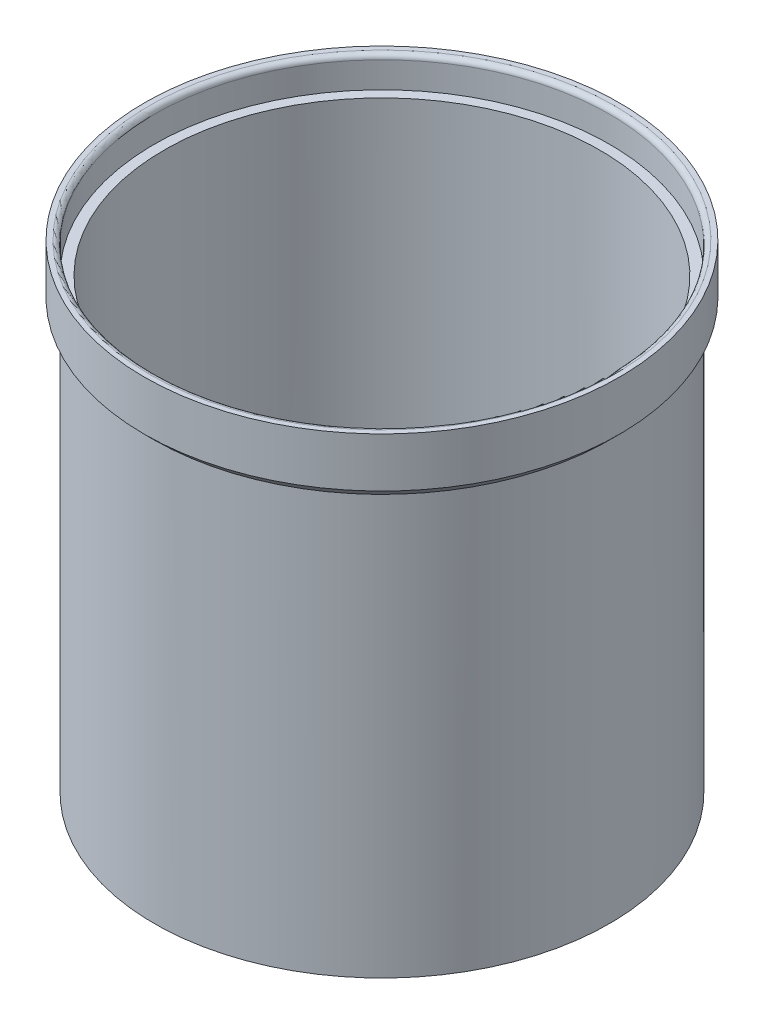
ISO-10303-21;
HEADER;
FILE_DESCRIPTION(('STEP AP214'),'2;1');
FILE_NAME('part.step','',(''),(''),'','','');
FILE_SCHEMA(('AUTOMOTIVE_DESIGN { 1 0 10303 214 1 1 1 1 }'));
ENDSEC;
DATA;
#1=APPLICATION_CONTEXT('core data for automotive mechanical design processes');
#2=APPLICATION_PROTOCOL_DEFINITION('international standard','automotive_design',2000,#1);
#3=PRODUCT_CONTEXT('',#1,'mechanical');
#4=PRODUCT('Part','Part','',(#3));
#5=PRODUCT_RELATED_PRODUCT_CATEGORY('part','',(#4));
#6=PRODUCT_DEFINITION_FORMATION('','',#4);
#7=PRODUCT_DEFINITION_CONTEXT('part definition',#1,'design');
#8=PRODUCT_DEFINITION('design','',#6,#7);
#9=PRODUCT_DEFINITION_SHAPE('','',#8);
#10=(LENGTH_UNIT() NAMED_UNIT(*) SI_UNIT(.MILLI.,.METRE.));
#11=(NAMED_UNIT(*) PLANE_ANGLE_UNIT() SI_UNIT($,.RADIAN.));
#12=(NAMED_UNIT(*) SI_UNIT($,.STERADIAN.) SOLID_ANGLE_UNIT());
#13=UNCERTAINTY_MEASURE_WITH_UNIT(LENGTH_MEASURE(1.E-05),#10,'distance_accuracy_value','');
#14=(GEOMETRIC_REPRESENTATION_CONTEXT(3) GLOBAL_UNCERTAINTY_ASSIGNED_CONTEXT((#13)) GLOBAL_UNIT_ASSIGNED_CONTEXT((#10,
#11,#12)) REPRESENTATION_CONTEXT('',''));
#15=CARTESIAN_POINT('',(0.,0.,0.));
#16=DIRECTION('',(0.,0.,1.));
#17=DIRECTION('',(1.,0.,0.));
#18=AXIS2_PLACEMENT_3D('',#15,#16,#17);
#19=CARTESIAN_POINT('',(0.,70.,0.));
#20=DIRECTION('',(0.,-1.,0.));
#21=DIRECTION('',(0.,0.,-1.));
#22=AXIS2_PLACEMENT_3D('',#19,#20,#21);
#23=CYLINDRICAL_SURFACE('',#22,36.8);
#24=CARTESIAN_POINT('',(0.,65.4,0.));
#25=DIRECTION('',(0.,1.,0.));
#26=DIRECTION('',(0.,0.,1.));
#27=AXIS2_PLACEMENT_3D('',#24,#25,#26);
#28=CIRCLE('',#27,36.8);
#29=CARTESIAN_POINT('',(0.,65.4,36.8));
#30=VERTEX_POINT('',#29);
#31=EDGE_CURVE('E51',#30,#30,#28,.F.);
#32=ORIENTED_EDGE('',*,*,#31,.T.);
#33=EDGE_LOOP('',(#32));
#34=FACE_BOUND('',#33,.T.);
#35=CARTESIAN_POINT('',(0.,-2.3,0.));
#36=DIRECTION('',(0.,-1.,0.));
#37=DIRECTION('',(0.,0.,-1.));
#38=AXIS2_PLACEMENT_3D('',#35,#36,#37);
#39=CIRCLE('',#38,36.8);
#40=CARTESIAN_POINT('',(0.,-2.3,-36.8));
#41=VERTEX_POINT('',#40);
#42=EDGE_CURVE('E66',#41,#41,#39,.T.);
#43=ORIENTED_EDGE('',*,*,#42,.F.);
#44=EDGE_LOOP('',(#43));
#45=FACE_BOUND('',#44,.T.);
#46=ADVANCED_FACE('F31',(#34,#45),#23,.T.);
#47=CARTESIAN_POINT('',(0.,70.,0.));
#48=DIRECTION('',(0.,1.,0.));
#49=DIRECTION('',(0.,0.,1.));
#50=AXIS2_PLACEMENT_3D('',#47,#48,#49);
#51=PLANE('',#50);
#52=CARTESIAN_POINT('',(0.,70.,0.));
#53=DIRECTION('',(0.,1.,0.));
#54=DIRECTION('',(0.,0.,1.));
#55=AXIS2_PLACEMENT_3D('',#52,#53,#54);
#56=CIRCLE('',#55,36.8);
#57=CARTESIAN_POINT('',(0.,70.,36.8));
#58=VERTEX_POINT('',#57);
#59=EDGE_CURVE('E60',#58,#58,#56,.T.);
#60=ORIENTED_EDGE('',*,*,#59,.T.);
#61=EDGE_LOOP('',(#60));
#62=FACE_BOUND('',#61,.T.);
#63=CARTESIAN_POINT('',(0.,70.,0.));
#64=DIRECTION('',(0.,1.,0.));
#65=DIRECTION('',(0.,0.,1.));
#66=AXIS2_PLACEMENT_3D('',#63,#64,#65);
#67=CIRCLE('',#66,35.2);
#68=CARTESIAN_POINT('',(0.,70.,35.2));
#69=VERTEX_POINT('',#68);
#70=EDGE_CURVE('E57',#69,#69,#67,.T.);
#71=ORIENTED_EDGE('',*,*,#70,.F.);
#72=EDGE_LOOP('',(#71));
#73=FACE_BOUND('',#72,.T.);
#74=ADVANCED_FACE('F89',(#62,#73),#51,.T.);
#75=CARTESIAN_POINT('',(0.,70.,0.));
#76=DIRECTION('',(0.,-1.,0.));
#77=DIRECTION('',(0.,0.,-1.));
#78=AXIS2_PLACEMENT_3D('',#75,#76,#77);
#79=CYLINDRICAL_SURFACE('',#78,35.2);
#80=CARTESIAN_POINT('',(0.,1.00000000000003,0.));
#81=DIRECTION('',(0.,1.,0.));
#82=DIRECTION('',(0.,0.,1.));
#83=AXIS2_PLACEMENT_3D('',#80,#81,#82);
#84=CIRCLE('',#83,35.2);
#85=CARTESIAN_POINT('',(0.,1.00000000000003,35.2));
#86=VERTEX_POINT('',#85);
#87=EDGE_CURVE('E38',#86,#86,#84,.F.);
#88=ORIENTED_EDGE('',*,*,#87,.T.);
#89=EDGE_LOOP('',(#88));
#90=FACE_BOUND('',#89,.T.);
#91=ORIENTED_EDGE('',*,*,#70,.T.);
#92=EDGE_LOOP('',(#91));
#93=FACE_BOUND('',#92,.T.);
#94=ADVANCED_FACE('F95',(#90,#93),#79,.F.);
#95=CARTESIAN_POINT('',(0.,65.,0.));
#96=DIRECTION('',(0.,1.,0.));
#97=DIRECTION('',(0.,0.,1.));
#98=AXIS2_PLACEMENT_3D('',#95,#96,#97);
#99=CYLINDRICAL_SURFACE('',#98,38.4);
#100=CARTESIAN_POINT('',(0.,67.,0.));
#101=DIRECTION('',(0.,1.,0.));
#102=DIRECTION('',(0.,0.,1.));
#103=AXIS2_PLACEMENT_3D('',#100,#101,#102);
#104=CIRCLE('',#103,38.4);
#105=CARTESIAN_POINT('',(0.,67.,38.4));
#106=VERTEX_POINT('',#105);
#107=EDGE_CURVE('E54',#106,#106,#104,.T.);
#108=ORIENTED_EDGE('',*,*,#107,.T.);
#109=EDGE_LOOP('',(#108));
#110=FACE_BOUND('',#109,.T.);
#111=CARTESIAN_POINT('',(0.,75.,0.));
#112=DIRECTION('',(0.,1.,0.));
#113=DIRECTION('',(0.,0.,1.));
#114=AXIS2_PLACEMENT_3D('',#111,#112,#113);
#115=CIRCLE('',#114,38.4);
#116=CARTESIAN_POINT('',(0.,75.,38.4));
#117=VERTEX_POINT('',#116);
#118=EDGE_CURVE('E63',#117,#117,#115,.T.);
#119=ORIENTED_EDGE('',*,*,#118,.F.);
#120=EDGE_LOOP('',(#119));
#121=FACE_BOUND('',#120,.T.);
#122=ADVANCED_FACE('F113',(#110,#121),#99,.T.);
#123=CARTESIAN_POINT('',(0.,65.,0.));
#124=DIRECTION('',(0.,1.,0.));
#125=DIRECTION('',(0.,0.,1.));
#126=AXIS2_PLACEMENT_3D('',#123,#124,#125);
#127=CYLINDRICAL_SURFACE('',#126,36.8);
#128=CARTESIAN_POINT('',(0.,74.2,0.));
#129=DIRECTION('',(0.,1.,0.));
#130=DIRECTION('',(0.,0.,1.));
#131=AXIS2_PLACEMENT_3D('',#128,#129,#130);
#132=CIRCLE('',#131,36.8);
#133=CARTESIAN_POINT('',(0.,74.2,36.8));
#134=VERTEX_POINT('',#133);
#135=EDGE_CURVE('E46',#134,#134,#132,.T.);
#136=ORIENTED_EDGE('',*,*,#135,.T.);
#137=EDGE_LOOP('',(#136));
#138=FACE_BOUND('',#137,.T.);
#139=ORIENTED_EDGE('',*,*,#59,.F.);
#140=EDGE_LOOP('',(#139));
#141=FACE_BOUND('',#140,.T.);
#142=ADVANCED_FACE('F107',(#138,#141),#127,.F.);
#143=CARTESIAN_POINT('',(0.,75.,0.));
#144=DIRECTION('',(0.,1.,0.));
#145=DIRECTION('',(0.,0.,1.));
#146=AXIS2_PLACEMENT_3D('',#143,#144,#145);
#147=PLANE('',#146);
#148=CARTESIAN_POINT('',(0.,75.,0.));
#149=DIRECTION('',(0.,1.,0.));
#150=DIRECTION('',(0.,0.,1.));
#151=AXIS2_PLACEMENT_3D('',#148,#149,#150);
#152=CIRCLE('',#151,37.6);
#153=CARTESIAN_POINT('',(0.,75.,37.6));
#154=VERTEX_POINT('',#153);
#155=EDGE_CURVE('E42',#154,#154,#152,.F.);
#156=ORIENTED_EDGE('',*,*,#155,.T.);
#157=EDGE_LOOP('',(#156));
#158=FACE_BOUND('',#157,.T.);
#159=ORIENTED_EDGE('',*,*,#118,.T.);
#160=EDGE_LOOP('',(#159));
#161=FACE_BOUND('',#160,.T.);
#162=ADVANCED_FACE('F102',(#158,#161),#147,.T.);
#163=CARTESIAN_POINT('',(0.,67.,0.));
#164=DIRECTION('',(0.,1.,0.));
#165=DIRECTION('',(0.,0.,1.));
#166=AXIS2_PLACEMENT_3D('',#163,#164,#165);
#167=CONICAL_SURFACE('',#166,38.4,0.785398163397445);
#168=ORIENTED_EDGE('',*,*,#31,.F.);
#169=EDGE_LOOP('',(#168));
#170=FACE_BOUND('',#169,.T.);
#171=ORIENTED_EDGE('',*,*,#107,.F.);
#172=EDGE_LOOP('',(#171));
#173=FACE_BOUND('',#172,.T.);
#174=ADVANCED_FACE('F84',(#170,#173),#167,.T.);
#175=CARTESIAN_POINT('',(0.,74.2,0.));
#176=DIRECTION('',(0.,1.,0.));
#177=DIRECTION('',(0.,0.,1.));
#178=AXIS2_PLACEMENT_3D('',#175,#176,#177);
#179=TOROIDAL_SURFACE('',#178,37.6,0.8);
#180=ORIENTED_EDGE('',*,*,#155,.F.);
#181=EDGE_LOOP('',(#180));
#182=FACE_BOUND('',#181,.T.);
#183=ORIENTED_EDGE('',*,*,#135,.F.);
#184=EDGE_LOOP('',(#183));
#185=FACE_BOUND('',#184,.T.);
#186=ADVANCED_FACE('F77',(#182,#185),#179,.T.);
#187=CARTESIAN_POINT('',(0.,-2.3,0.));
#188=DIRECTION('',(0.,1.,0.));
#189=DIRECTION('',(0.,0.,1.));
#190=AXIS2_PLACEMENT_3D('',#187,#188,#189);
#191=CYLINDRICAL_SURFACE('',#190,36.2);
#192=CARTESIAN_POINT('',(0.,-1.7,0.));
#193=DIRECTION('',(0.,-1.,0.));
#194=DIRECTION('',(0.,0.,-1.));
#195=AXIS2_PLACEMENT_3D('',#192,#193,#194);
#196=CIRCLE('',#195,36.2);
#197=CARTESIAN_POINT('',(0.,-1.7,-36.2));
#198=VERTEX_POINT('',#197);
#199=EDGE_CURVE('E10',#198,#198,#196,.T.);
#200=ORIENTED_EDGE('',*,*,#199,.T.);
#201=EDGE_LOOP('',(#200));
#202=FACE_BOUND('',#201,.T.);
#203=CARTESIAN_POINT('',(0.,0.,0.));
#204=DIRECTION('',(0.,-1.,0.));
#205=DIRECTION('',(0.,0.,-1.));
#206=AXIS2_PLACEMENT_3D('',#203,#204,#205);
#207=CIRCLE('',#206,36.2);
#208=CARTESIAN_POINT('',(0.,0.,-36.2));
#209=VERTEX_POINT('',#208);
#210=EDGE_CURVE('E69',#209,#209,#207,.T.);
#211=ORIENTED_EDGE('',*,*,#210,.F.);
#212=EDGE_LOOP('',(#211));
#213=FACE_BOUND('',#212,.T.);
#214=ADVANCED_FACE('F75',(#202,#213),#191,.F.);
#215=CARTESIAN_POINT('',(0.,0.,0.));
#216=DIRECTION('',(0.,-1.,0.));
#217=DIRECTION('',(0.,0.,-1.));
#218=AXIS2_PLACEMENT_3D('',#215,#216,#217);
#219=CONICAL_SURFACE('',#218,36.2,0.785398163397435);
#220=ORIENTED_EDGE('',*,*,#87,.F.);
#221=EDGE_LOOP('',(#220));
#222=FACE_BOUND('',#221,.T.);
#223=ORIENTED_EDGE('',*,*,#210,.T.);
#224=EDGE_LOOP('',(#223));
#225=FACE_BOUND('',#224,.T.);
#226=ADVANCED_FACE('F73',(#222,#225),#219,.F.);
#227=CARTESIAN_POINT('',(0.,-1.7,0.));
#228=DIRECTION('',(0.,-1.,0.));
#229=DIRECTION('',(0.,0.,-1.));
#230=AXIS2_PLACEMENT_3D('',#227,#228,#229);
#231=TOROIDAL_SURFACE('',#230,36.8,0.6);
#232=ORIENTED_EDGE('',*,*,#42,.T.);
#233=EDGE_LOOP('',(#232));
#234=FACE_BOUND('',#233,.T.);
#235=ORIENTED_EDGE('',*,*,#199,.F.);
#236=EDGE_LOOP('',(#235));
#237=FACE_BOUND('',#236,.T.);
#238=ADVANCED_FACE('F33',(#234,#237),#231,.T.);
#239=CLOSED_SHELL('',(#46,#74,#94,#122,#142,#162,#174,#186,#214,#226,#238));
#240=MANIFOLD_SOLID_BREP('B2',#239);
#241=ADVANCED_BREP_SHAPE_REPRESENTATION('',(#18,#240),#14);
#242=SHAPE_DEFINITION_REPRESENTATION(#9,#241);
ENDSEC;
END-ISO-10303-21;
